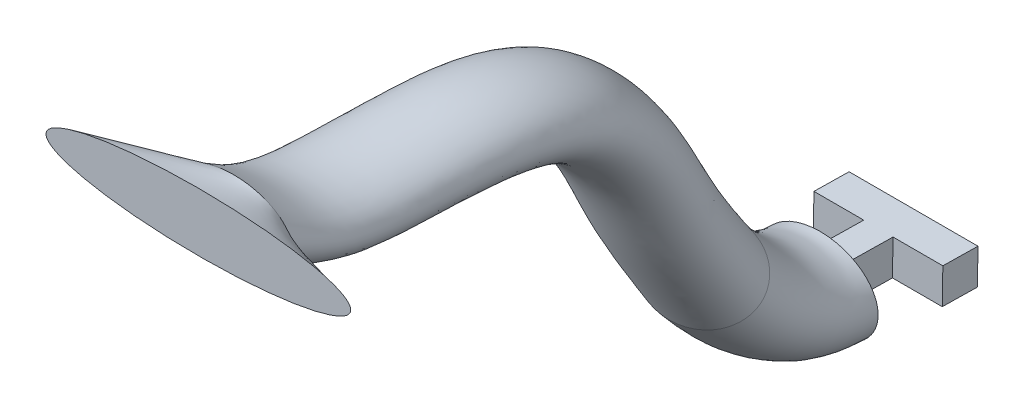
ISO-10303-21;
HEADER;
FILE_DESCRIPTION(('STEP AP214'),'2;1');
FILE_NAME('part.step','',(''),(''),'','','');
FILE_SCHEMA(('AUTOMOTIVE_DESIGN { 1 0 10303 214 1 1 1 1 }'));
ENDSEC;
DATA;
#1=APPLICATION_CONTEXT('core data for automotive mechanical design processes');
#2=APPLICATION_PROTOCOL_DEFINITION('international standard','automotive_design',2000,#1);
#3=PRODUCT_CONTEXT('',#1,'mechanical');
#4=PRODUCT('Part','Part','',(#3));
#5=PRODUCT_RELATED_PRODUCT_CATEGORY('part','',(#4));
#6=PRODUCT_DEFINITION_FORMATION('','',#4);
#7=PRODUCT_DEFINITION_CONTEXT('part definition',#1,'design');
#8=PRODUCT_DEFINITION('design','',#6,#7);
#9=PRODUCT_DEFINITION_SHAPE('','',#8);
#10=(LENGTH_UNIT() NAMED_UNIT(*) SI_UNIT(.MILLI.,.METRE.));
#11=(NAMED_UNIT(*) PLANE_ANGLE_UNIT() SI_UNIT($,.RADIAN.));
#12=(NAMED_UNIT(*) SI_UNIT($,.STERADIAN.) SOLID_ANGLE_UNIT());
#13=UNCERTAINTY_MEASURE_WITH_UNIT(LENGTH_MEASURE(1.E-05),#10,'distance_accuracy_value','');
#14=(GEOMETRIC_REPRESENTATION_CONTEXT(3) GLOBAL_UNCERTAINTY_ASSIGNED_CONTEXT((#13)) GLOBAL_UNIT_ASSIGNED_CONTEXT((#10,
#11,#12)) REPRESENTATION_CONTEXT('',''));
#15=CARTESIAN_POINT('',(0.,0.,0.));
#16=DIRECTION('',(0.,0.,1.));
#17=DIRECTION('',(1.,0.,0.));
#18=AXIS2_PLACEMENT_3D('',#15,#16,#17);
#19=CARTESIAN_POINT('',(1.25,-28.5002006384358,-55.0245456775714));
#20=DIRECTION('',(-1.,0.,0.));
#21=DIRECTION('',(0.,-1.,0.));
#22=AXIS2_PLACEMENT_3D('',#19,#20,#21);
#23=PLANE('',#22);
#24=DIRECTION('',(0.,-0.999857410804947,0.0168866236538769));
#25=VECTOR('',#24,1.);
#26=CARTESIAN_POINT('',(1.25,-28.4157675201664,-50.0252586235467));
#27=LINE('',#26,#25);
#28=CARTESIAN_POINT('',(1.25,-28.4157675201664,-50.0252586235467));
#29=VERTEX_POINT('',#28);
#30=CARTESIAN_POINT('',(1.24999999999999,-31.4153397525812,-49.974598752585));
#31=VERTEX_POINT('',#30);
#32=EDGE_CURVE('E113',#29,#31,#27,.T.);
#33=ORIENTED_EDGE('',*,*,#32,.T.);
#34=DIRECTION('',(0.,0.0168866236538767,0.999857410804947));
#35=VECTOR('',#34,1.);
#36=CARTESIAN_POINT('',(1.24999999999999,-31.4997728708506,-54.9738858066098));
#37=LINE('',#36,#35);
#38=CARTESIAN_POINT('',(1.25,-31.4997728708506,-54.9738858066098));
#39=VERTEX_POINT('',#38);
#40=EDGE_CURVE('E13',#39,#31,#37,.T.);
#41=ORIENTED_EDGE('',*,*,#40,.F.);
#42=DIRECTION('',(0.,-0.999857410804947,0.0168866236538769));
#43=VECTOR('',#42,1.);
#44=CARTESIAN_POINT('',(1.25,-28.5002006384358,-55.0245456775714));
#45=LINE('',#44,#43);
#46=CARTESIAN_POINT('',(1.25,-28.5002006384358,-55.0245456775714));
#47=VERTEX_POINT('',#46);
#48=EDGE_CURVE('E114',#47,#39,#45,.T.);
#49=ORIENTED_EDGE('',*,*,#48,.F.);
#50=DIRECTION('',(0.,0.0168866236538767,0.999857410804947));
#51=VECTOR('',#50,1.);
#52=CARTESIAN_POINT('',(1.25,-28.5002006384358,-55.0245456775714));
#53=LINE('',#52,#51);
#54=EDGE_CURVE('E101',#47,#29,#53,.T.);
#55=ORIENTED_EDGE('',*,*,#54,.T.);
#56=EDGE_LOOP('',(#33,#41,#49,#55));
#57=FACE_BOUND('',#56,.T.);
#58=ADVANCED_FACE('F55',(#57),#23,.F.);
#59=CARTESIAN_POINT('',(1.24999999999999,-31.4997728708506,-54.9738858066098));
#60=DIRECTION('',(0.,0.999857410804947,-0.0168866236538767));
#61=DIRECTION('',(0.,0.0168866236538767,0.999857410804947));
#62=AXIS2_PLACEMENT_3D('',#59,#60,#61);
#63=PLANE('',#62);
#64=DIRECTION('',(-1.,0.,0.));
#65=VECTOR('',#64,1.);
#66=CARTESIAN_POINT('',(1.24999999999999,-31.4153397525812,-49.974598752585));
#67=LINE('',#66,#65);
#68=CARTESIAN_POINT('',(-1.25000000000001,-31.4153397525812,-49.974598752585));
#69=VERTEX_POINT('',#68);
#70=EDGE_CURVE('E108',#31,#69,#67,.T.);
#71=ORIENTED_EDGE('',*,*,#70,.T.);
#72=DIRECTION('',(0.,0.0168866236538767,0.999857410804947));
#73=VECTOR('',#72,1.);
#74=CARTESIAN_POINT('',(-1.25000000000001,-31.4997728708506,-54.9738858066098));
#75=LINE('',#74,#73);
#76=CARTESIAN_POINT('',(-1.25000000000001,-31.4997728708506,-54.9738858066098));
#77=VERTEX_POINT('',#76);
#78=EDGE_CURVE('E64',#77,#69,#75,.T.);
#79=ORIENTED_EDGE('',*,*,#78,.F.);
#80=DIRECTION('',(-1.,0.,0.));
#81=VECTOR('',#80,1.);
#82=CARTESIAN_POINT('',(5.50000000000001,-31.4997728708506,-54.9738858066098));
#83=LINE('',#82,#81);
#84=CARTESIAN_POINT('',(-5.49999999999998,-31.4997728708506,-54.9738858066098));
#85=VERTEX_POINT('',#84);
#86=EDGE_CURVE('E71',#77,#85,#83,.T.);
#87=ORIENTED_EDGE('',*,*,#86,.T.);
#88=DIRECTION('',(0.,0.0168866236538769,0.999857410804947));
#89=VECTOR('',#88,1.);
#90=CARTESIAN_POINT('',(-5.49999999999998,-31.5504327418122,-57.9734580390246));
#91=LINE('',#90,#89);
#92=CARTESIAN_POINT('',(-5.49999999999998,-31.5504327418122,-57.9734580390246));
#93=VERTEX_POINT('',#92);
#94=EDGE_CURVE('E209',#93,#85,#91,.T.);
#95=ORIENTED_EDGE('',*,*,#94,.F.);
#96=DIRECTION('',(-1.,0.,0.));
#97=VECTOR('',#96,1.);
#98=CARTESIAN_POINT('',(5.50000000000001,-31.5504327418122,-57.9734580390246));
#99=LINE('',#98,#97);
#100=CARTESIAN_POINT('',(5.50000000000001,-31.5504327418122,-57.9734580390246));
#101=VERTEX_POINT('',#100);
#102=EDGE_CURVE('E181',#101,#93,#99,.T.);
#103=ORIENTED_EDGE('',*,*,#102,.F.);
#104=DIRECTION('',(0.,0.0168866236538769,0.999857410804947));
#105=VECTOR('',#104,1.);
#106=CARTESIAN_POINT('',(5.50000000000001,-31.5504327418122,-57.9734580390246));
#107=LINE('',#106,#105);
#108=CARTESIAN_POINT('',(5.50000000000001,-31.4997728708506,-54.9738858066098));
#109=VERTEX_POINT('',#108);
#110=EDGE_CURVE('E131',#101,#109,#107,.T.);
#111=ORIENTED_EDGE('',*,*,#110,.T.);
#112=EDGE_CURVE('E138',#109,#39,#83,.T.);
#113=ORIENTED_EDGE('',*,*,#112,.T.);
#114=ORIENTED_EDGE('',*,*,#40,.T.);
#115=EDGE_LOOP('',(#71,#79,#87,#95,#103,#111,#113,#114));
#116=FACE_BOUND('',#115,.T.);
#117=ADVANCED_FACE('F133',(#116),#63,.F.);
#118=CARTESIAN_POINT('',(-1.25,-28.5002006384358,-55.0245456775714));
#119=DIRECTION('',(-1.,0.,0.));
#120=DIRECTION('',(0.,-1.,0.));
#121=AXIS2_PLACEMENT_3D('',#118,#119,#120);
#122=PLANE('',#121);
#123=DIRECTION('',(0.,-0.999857410804947,0.0168866236538769));
#124=VECTOR('',#123,1.);
#125=CARTESIAN_POINT('',(-1.25,-28.4157675201664,-50.0252586235467));
#126=LINE('',#125,#124);
#127=CARTESIAN_POINT('',(-1.25,-28.4157675201664,-50.0252586235467));
#128=VERTEX_POINT('',#127);
#129=EDGE_CURVE('E104',#128,#69,#126,.T.);
#130=ORIENTED_EDGE('',*,*,#129,.F.);
#131=DIRECTION('',(0.,0.0168866236538767,0.999857410804947));
#132=VECTOR('',#131,1.);
#133=CARTESIAN_POINT('',(-1.25,-28.5002006384358,-55.0245456775714));
#134=LINE('',#133,#132);
#135=CARTESIAN_POINT('',(-1.25000000000001,-28.5002006384358,-55.0245456775714));
#136=VERTEX_POINT('',#135);
#137=EDGE_CURVE('E89',#136,#128,#134,.T.);
#138=ORIENTED_EDGE('',*,*,#137,.F.);
#139=DIRECTION('',(0.,-0.999857410804947,0.0168866236538769));
#140=VECTOR('',#139,1.);
#141=CARTESIAN_POINT('',(-1.25,-28.5002006384358,-55.0245456775714));
#142=LINE('',#141,#140);
#143=EDGE_CURVE('E117',#136,#77,#142,.T.);
#144=ORIENTED_EDGE('',*,*,#143,.T.);
#145=ORIENTED_EDGE('',*,*,#78,.T.);
#146=EDGE_LOOP('',(#130,#138,#144,#145));
#147=FACE_BOUND('',#146,.T.);
#148=ADVANCED_FACE('F105',(#147),#122,.T.);
#149=CARTESIAN_POINT('',(1.25,-28.5002006384358,-55.0245456775714));
#150=DIRECTION('',(0.,0.999857410804947,-0.0168866236538767));
#151=DIRECTION('',(0.,0.0168866236538767,0.999857410804947));
#152=AXIS2_PLACEMENT_3D('',#149,#150,#151);
#153=PLANE('',#152);
#154=DIRECTION('',(-1.,0.,0.));
#155=VECTOR('',#154,1.);
#156=CARTESIAN_POINT('',(1.25,-28.4157675201664,-50.0252586235467));
#157=LINE('',#156,#155);
#158=EDGE_CURVE('E94',#29,#128,#157,.T.);
#159=ORIENTED_EDGE('',*,*,#158,.F.);
#160=ORIENTED_EDGE('',*,*,#54,.F.);
#161=DIRECTION('',(-1.,0.,0.));
#162=VECTOR('',#161,1.);
#163=CARTESIAN_POINT('',(5.50000000000001,-28.5002006384358,-55.0245456775714));
#164=LINE('',#163,#162);
#165=CARTESIAN_POINT('',(5.50000000000001,-28.5002006384358,-55.0245456775714));
#166=VERTEX_POINT('',#165);
#167=EDGE_CURVE('E150',#166,#47,#164,.T.);
#168=ORIENTED_EDGE('',*,*,#167,.F.);
#169=DIRECTION('',(0.,0.0168866236538769,0.999857410804947));
#170=VECTOR('',#169,1.);
#171=CARTESIAN_POINT('',(5.50000000000001,-28.5508605093974,-58.0241179099862));
#172=LINE('',#171,#170);
#173=CARTESIAN_POINT('',(5.50000000000001,-28.5508605093974,-58.0241179099862));
#174=VERTEX_POINT('',#173);
#175=EDGE_CURVE('E174',#174,#166,#172,.T.);
#176=ORIENTED_EDGE('',*,*,#175,.F.);
#177=DIRECTION('',(-1.,0.,0.));
#178=VECTOR('',#177,1.);
#179=CARTESIAN_POINT('',(5.50000000000001,-28.5508605093974,-58.0241179099862));
#180=LINE('',#179,#178);
#181=CARTESIAN_POINT('',(-5.49999999999998,-28.5508605093974,-58.0241179099862));
#182=VERTEX_POINT('',#181);
#183=EDGE_CURVE('E176',#174,#182,#180,.T.);
#184=ORIENTED_EDGE('',*,*,#183,.T.);
#185=DIRECTION('',(0.,0.0168866236538769,0.999857410804947));
#186=VECTOR('',#185,1.);
#187=CARTESIAN_POINT('',(-5.49999999999998,-28.5508605093974,-58.0241179099862));
#188=LINE('',#187,#186);
#189=CARTESIAN_POINT('',(-5.49999999999998,-28.5002006384358,-55.0245456775714));
#190=VERTEX_POINT('',#189);
#191=EDGE_CURVE('E180',#182,#190,#188,.T.);
#192=ORIENTED_EDGE('',*,*,#191,.T.);
#193=EDGE_CURVE('E98',#136,#190,#164,.T.);
#194=ORIENTED_EDGE('',*,*,#193,.F.);
#195=ORIENTED_EDGE('',*,*,#137,.T.);
#196=EDGE_LOOP('',(#159,#160,#168,#176,#184,#192,#194,#195));
#197=FACE_BOUND('',#196,.T.);
#198=ADVANCED_FACE('F91',(#197),#153,.T.);
#199=CARTESIAN_POINT('',(0.,-0.852740247335799,-50.4907714689664));
#200=DIRECTION('',(0.,-0.0168866236538769,-0.999857410804947));
#201=DIRECTION('',(0.,0.999857410804947,-0.0168866236538769));
#202=AXIS2_PLACEMENT_3D('',#199,#200,#201);
#203=PLANE('',#202);
#204=ORIENTED_EDGE('',*,*,#32,.F.);
#205=ORIENTED_EDGE('',*,*,#158,.T.);
#206=ORIENTED_EDGE('',*,*,#129,.T.);
#207=ORIENTED_EDGE('',*,*,#70,.F.);
#208=EDGE_LOOP('',(#204,#205,#206,#207));
#209=FACE_BOUND('',#208,.T.);
#210=ADVANCED_FACE('F111',(#209),#203,.F.);
#211=CARTESIAN_POINT('',(0.,-0.937173365605184,-55.4900585229912));
#212=DIRECTION('',(0.,0.0168866236538769,0.999857410804947));
#213=DIRECTION('',(0.,-0.999857410804947,0.0168866236538769));
#214=AXIS2_PLACEMENT_3D('',#211,#212,#213);
#215=PLANE('',#214);
#216=ORIENTED_EDGE('',*,*,#143,.F.);
#217=ORIENTED_EDGE('',*,*,#193,.T.);
#218=DIRECTION('',(0.,0.999857410804947,-0.0168866236538769));
#219=VECTOR('',#218,1.);
#220=CARTESIAN_POINT('',(-5.49999999999998,-31.4997728708506,-54.9738858066098));
#221=LINE('',#220,#219);
#222=EDGE_CURVE('E202',#85,#190,#221,.T.);
#223=ORIENTED_EDGE('',*,*,#222,.F.);
#224=ORIENTED_EDGE('',*,*,#86,.F.);
#225=EDGE_LOOP('',(#216,#217,#223,#224));
#226=FACE_BOUND('',#225,.T.);
#227=ADVANCED_FACE('F218',(#226),#215,.T.);
#228=CARTESIAN_POINT('',(5.50000000000001,-31.5504327418122,-57.9734580390246));
#229=DIRECTION('',(1.,0.,0.));
#230=DIRECTION('',(0.,0.,-1.));
#231=AXIS2_PLACEMENT_3D('',#228,#229,#230);
#232=PLANE('',#231);
#233=DIRECTION('',(0.,0.999857410804947,-0.0168866236538769));
#234=VECTOR('',#233,1.);
#235=CARTESIAN_POINT('',(5.50000000000001,-31.4997728708506,-54.9738858066098));
#236=LINE('',#235,#234);
#237=EDGE_CURVE('E198',#109,#166,#236,.T.);
#238=ORIENTED_EDGE('',*,*,#237,.F.);
#239=ORIENTED_EDGE('',*,*,#110,.F.);
#240=DIRECTION('',(0.,0.999857410804947,-0.0168866236538769));
#241=VECTOR('',#240,1.);
#242=CARTESIAN_POINT('',(5.50000000000001,-31.5504327418122,-57.9734580390246));
#243=LINE('',#242,#241);
#244=EDGE_CURVE('E186',#101,#174,#243,.T.);
#245=ORIENTED_EDGE('',*,*,#244,.T.);
#246=ORIENTED_EDGE('',*,*,#175,.T.);
#247=EDGE_LOOP('',(#238,#239,#245,#246));
#248=FACE_BOUND('',#247,.T.);
#249=ADVANCED_FACE('F191',(#248),#232,.T.);
#250=CARTESIAN_POINT('',(-5.49999999999998,-31.5504327418122,-57.9734580390246));
#251=DIRECTION('',(1.,0.,0.));
#252=DIRECTION('',(0.,0.,-1.));
#253=AXIS2_PLACEMENT_3D('',#250,#251,#252);
#254=PLANE('',#253);
#255=ORIENTED_EDGE('',*,*,#222,.T.);
#256=ORIENTED_EDGE('',*,*,#191,.F.);
#257=DIRECTION('',(0.,0.999857410804947,-0.0168866236538769));
#258=VECTOR('',#257,1.);
#259=CARTESIAN_POINT('',(-5.49999999999998,-31.5504327418122,-57.9734580390246));
#260=LINE('',#259,#258);
#261=EDGE_CURVE('E188',#93,#182,#260,.T.);
#262=ORIENTED_EDGE('',*,*,#261,.F.);
#263=ORIENTED_EDGE('',*,*,#94,.T.);
#264=EDGE_LOOP('',(#255,#256,#262,#263));
#265=FACE_BOUND('',#264,.T.);
#266=ADVANCED_FACE('F217',(#265),#254,.F.);
#267=CARTESIAN_POINT('',(0.,-0.987833236566815,-58.489630755406));
#268=DIRECTION('',(0.,0.0168866236538769,0.999857410804947));
#269=DIRECTION('',(0.,-0.999857410804947,0.0168866236538769));
#270=AXIS2_PLACEMENT_3D('',#267,#268,#269);
#271=PLANE('',#270);
#272=ORIENTED_EDGE('',*,*,#244,.F.);
#273=ORIENTED_EDGE('',*,*,#102,.T.);
#274=ORIENTED_EDGE('',*,*,#261,.T.);
#275=ORIENTED_EDGE('',*,*,#183,.F.);
#276=EDGE_LOOP('',(#272,#273,#274,#275));
#277=FACE_BOUND('',#276,.T.);
#278=ADVANCED_FACE('F185',(#277),#271,.F.);
#279=ORIENTED_EDGE('',*,*,#167,.T.);
#280=ORIENTED_EDGE('',*,*,#48,.T.);
#281=ORIENTED_EDGE('',*,*,#112,.F.);
#282=ORIENTED_EDGE('',*,*,#237,.T.);
#283=EDGE_LOOP('',(#279,#280,#281,#282));
#284=FACE_BOUND('',#283,.T.);
#285=ADVANCED_FACE('F221',(#284),#215,.T.);
#286=CLOSED_SHELL('',(#58,#117,#148,#198,#210,#227,#249,#266,#278,#285));
#287=MANIFOLD_SOLID_BREP('B2',#286);
#288=CARTESIAN_POINT('',(-5.,0.,0.));
#289=CARTESIAN_POINT('',(-5.,-0.853881450719064,-1.75205988960103));
#290=CARTESIAN_POINT('',(-5.,-2.57155411642172,-5.27651328826358));
#291=CARTESIAN_POINT('',(-5.,-2.88270973912958,-11.2239530258684));
#292=CARTESIAN_POINT('',(-5.,-3.01079803413071,-16.4846982848515));
#293=CARTESIAN_POINT('',(-5.,-3.37813638586674,-21.0440263464884));
#294=CARTESIAN_POINT('',(-5.,-4.25009553557255,-24.7776377723047));
#295=CARTESIAN_POINT('',(-5.,-6.28883352384999,-28.8717387039558));
#296=CARTESIAN_POINT('',(-5.,-10.7793378739405,-32.7833273288068));
#297=CARTESIAN_POINT('',(-5.,-17.4395879114166,-35.7253039664786));
#298=CARTESIAN_POINT('',(-5.,-21.7394320086001,-38.5426413388619));
#299=CARTESIAN_POINT('',(-5.,-23.9729515029093,-40.0060846175115));
#300=CARTESIAN_POINT('',(-5.,-6.,0.));
#301=CARTESIAN_POINT('',(-5.,-6.74510752468008,-2.51089442414352));
#302=CARTESIAN_POINT('',(-5.,-8.24396995701722,-7.56182358437366));
#303=CARTESIAN_POINT('',(-5.,-8.32914554490508,-13.7976153515125));
#304=CARTESIAN_POINT('',(-5.,-8.68649045792541,-18.8056395754351));
#305=CARTESIAN_POINT('',(-5.,-9.51751271745117,-22.2908376495362));
#306=CARTESIAN_POINT('',(-4.99999999999999,-10.7073757400259,-24.4233851410402));
#307=CARTESIAN_POINT('',(-5.,-12.3199455425964,-25.5670665363477));
#308=CARTESIAN_POINT('',(-5.,-14.8588126708258,-27.2288486109863));
#309=CARTESIAN_POINT('',(-5.,-20.557216248969,-29.3999180690181));
#310=CARTESIAN_POINT('',(-5.,-25.8929775961605,-32.6467694813133));
#311=CARTESIAN_POINT('',(-5.,-28.6645959889624,-34.3333203795742));
#312=CARTESIAN_POINT('',(5.,-6.,0.));
#313=CARTESIAN_POINT('',(5.,-6.74510752468008,-2.51089442414352));
#314=CARTESIAN_POINT('',(5.,-8.24396995701722,-7.56182358437366));
#315=CARTESIAN_POINT('',(5.,-8.32914554490508,-13.7976153515125));
#316=CARTESIAN_POINT('',(5.,-8.68649045792541,-18.8056395754351));
#317=CARTESIAN_POINT('',(5.,-9.51751271745117,-22.2908376495362));
#318=CARTESIAN_POINT('',(5.,-10.7073757400259,-24.4233851410402));
#319=CARTESIAN_POINT('',(5.,-12.3199455425964,-25.5670665363477));
#320=CARTESIAN_POINT('',(5.,-14.8588126708258,-27.2288486109863));
#321=CARTESIAN_POINT('',(5.,-20.557216248969,-29.3999180690181));
#322=CARTESIAN_POINT('',(5.,-25.8929775961605,-32.6467694813133));
#323=CARTESIAN_POINT('',(5.,-28.6645959889624,-34.3333203795742));
#324=CARTESIAN_POINT('',(5.,0.,0.));
#325=CARTESIAN_POINT('',(5.,-0.853881450719064,-1.75205988960103));
#326=CARTESIAN_POINT('',(5.,-2.57155411642172,-5.27651328826358));
#327=CARTESIAN_POINT('',(5.,-2.88270973912958,-11.2239530258684));
#328=CARTESIAN_POINT('',(5.,-3.01079803413071,-16.4846982848515));
#329=CARTESIAN_POINT('',(5.,-3.37813638586674,-21.0440263464884));
#330=CARTESIAN_POINT('',(5.,-4.25009553557255,-24.7776377723047));
#331=CARTESIAN_POINT('',(5.,-6.28883352384999,-28.8717387039558));
#332=CARTESIAN_POINT('',(5.,-10.7793378739405,-32.7833273288068));
#333=CARTESIAN_POINT('',(5.,-17.4395879114166,-35.7253039664786));
#334=CARTESIAN_POINT('',(5.,-21.7394320086001,-38.5426413388619));
#335=CARTESIAN_POINT('',(5.,-23.9729515029093,-40.0060846175115));
#336=CARTESIAN_POINT('',(5.,6.,0.));
#337=CARTESIAN_POINT('',(5.,5.03734462324195,-0.993225355058546));
#338=CARTESIAN_POINT('',(5.,3.10086172417378,-2.99120299215349));
#339=CARTESIAN_POINT('',(5.,2.56372606664591,-8.6502907002242));
#340=CARTESIAN_POINT('',(5.,2.66489438966399,-14.1637569942678));
#341=CARTESIAN_POINT('',(5.,2.76123994571768,-19.7972150434406));
#342=CARTESIAN_POINT('',(4.99999999999999,2.20718466888083,-25.1318904035692));
#343=CARTESIAN_POINT('',(5.,-0.257721505103621,-32.176410871564));
#344=CARTESIAN_POINT('',(5.,-6.69986307705511,-38.3378060466272));
#345=CARTESIAN_POINT('',(5.,-14.3219595738643,-42.050689863939));
#346=CARTESIAN_POINT('',(5.,-17.5858864210396,-44.4385131964106));
#347=CARTESIAN_POINT('',(5.,-19.2813070168563,-45.6788488554488));
#348=CARTESIAN_POINT('',(-5.,6.,0.));
#349=CARTESIAN_POINT('',(-5.,5.03734462324195,-0.993225355058546));
#350=CARTESIAN_POINT('',(-5.,3.10086172417378,-2.99120299215349));
#351=CARTESIAN_POINT('',(-5.,2.56372606664591,-8.6502907002242));
#352=CARTESIAN_POINT('',(-5.,2.66489438966399,-14.1637569942678));
#353=CARTESIAN_POINT('',(-5.,2.76123994571768,-19.7972150434406));
#354=CARTESIAN_POINT('',(-5.,2.20718466888083,-25.1318904035692));
#355=CARTESIAN_POINT('',(-5.,-0.257721505103621,-32.176410871564));
#356=CARTESIAN_POINT('',(-5.,-6.69986307705511,-38.3378060466272));
#357=CARTESIAN_POINT('',(-5.,-14.3219595738643,-42.050689863939));
#358=CARTESIAN_POINT('',(-5.,-17.5858864210396,-44.4385131964106));
#359=CARTESIAN_POINT('',(-5.,-19.2813070168563,-45.6788488554488));
#360=CARTESIAN_POINT('',(-5.,0.,0.));
#361=CARTESIAN_POINT('',(-5.,-0.853881450719064,-1.75205988960103));
#362=CARTESIAN_POINT('',(-5.,-2.57155411642172,-5.27651328826358));
#363=CARTESIAN_POINT('',(-5.,-2.88270973912958,-11.2239530258684));
#364=CARTESIAN_POINT('',(-5.,-3.01079803413071,-16.4846982848515));
#365=CARTESIAN_POINT('',(-5.,-3.37813638586674,-21.0440263464884));
#366=CARTESIAN_POINT('',(-5.,-4.25009553557255,-24.7776377723047));
#367=CARTESIAN_POINT('',(-5.,-6.28883352384999,-28.8717387039558));
#368=CARTESIAN_POINT('',(-5.,-10.7793378739405,-32.7833273288068));
#369=CARTESIAN_POINT('',(-5.,-17.4395879114166,-35.7253039664786));
#370=CARTESIAN_POINT('',(-5.,-21.7394320086001,-38.5426413388619));
#371=CARTESIAN_POINT('',(-5.,-23.9729515029093,-40.0060846175115));
#372=(BOUNDED_SURFACE() B_SPLINE_SURFACE(3,3,((#288,#289,#290,#291,#292,#293,#294,#295,#296,
#297,#298,#299),(#300,#301,#302,#303,#304,#305,#306,#307,#308,#309,#310,#311),(#312,#313,#314,
#315,#316,#317,#318,#319,#320,#321,#322,#323),(#324,#325,#326,#327,#328,#329,#330,#331,#332,
#333,#334,#335),(#336,#337,#338,#339,#340,#341,#342,#343,#344,#345,#346,#347),(#348,#349,#350,
#351,#352,#353,#354,#355,#356,#357,#358,#359),(#360,#361,#362,#363,#364,#365,#366,#367,#368,
#369,#370,#371)),.UNSPECIFIED.,.T.,.F.,.F.) B_SPLINE_SURFACE_WITH_KNOTS((4,3,4),(4,1,1,1,1,1,1,
1,1,4),(0.,0.5,1.),(0.,0.115089111175291,0.231513894837905,0.344783295272171,0.42682553091255,
0.501516670505765,0.571283271466905,0.697446018738273,0.842840763535686,1.),
.UNSPECIFIED.) GEOMETRIC_REPRESENTATION_ITEM() RATIONAL_B_SPLINE_SURFACE(((1.,1.,1.,1.,1.,1.,1.,
1.,1.,1.,1.,1.),(0.333333333333333,0.333333333333333,0.333333333333333,0.333333333333334,
0.333333333333333,0.333333333333333,0.333333333333333,0.333333333333333,0.333333333333333,
0.333333333333333,0.333333333333333,0.333333333333333),(0.333333333333333,0.333333333333333,
0.333333333333333,0.333333333333334,0.333333333333333,0.333333333333333,0.333333333333333,
0.333333333333333,0.333333333333333,0.333333333333333,0.333333333333333,0.333333333333333),(1.,
1.,1.,1.,1.,1.,1.,1.,1.,1.,1.,1.),(0.333333333333333,0.333333333333333,0.333333333333333,
0.333333333333334,0.333333333333333,0.333333333333333,0.333333333333333,0.333333333333333,
0.333333333333333,0.333333333333333,0.333333333333333,0.333333333333333),(0.333333333333333,
0.333333333333333,0.333333333333333,0.333333333333334,0.333333333333333,0.333333333333333,
0.333333333333333,0.333333333333333,0.333333333333333,0.333333333333333,0.333333333333333,
0.333333333333333),(1.,1.,1.,1.,1.,1.,1.,1.,1.,1.,1.,1.))) REPRESENTATION_ITEM('') SURFACE());
#373=CARTESIAN_POINT('',(4.8040893261107,0.831541501567865,0.));
#374=CARTESIAN_POINT('',(2.03228432088449,6.59644869290071,0.));
#375=CARTESIAN_POINT('',(-7.57589433133692,4.93336568976498,0.));
#376=CARTESIAN_POINT('',(-4.8040893261107,-0.831541501567865,0.));
#377=CARTESIAN_POINT('',(-2.03228432088448,-6.5964486929007,0.));
#378=CARTESIAN_POINT('',(7.57589433133691,-4.93336568976497,0.));
#379=CARTESIAN_POINT('',(4.8040893261107,0.831541501567865,0.));
#380=(BOUNDED_CURVE() B_SPLINE_CURVE(3,(#373,#374,#375,#376,#377,#378,#379),.UNSPECIFIED.,.T.,
.F.) B_SPLINE_CURVE_WITH_KNOTS((4,3,4),(0.,0.5,1.),
.UNSPECIFIED.) CURVE() GEOMETRIC_REPRESENTATION_ITEM() RATIONAL_B_SPLINE_CURVE((1.,
0.333333333333333,0.333333333333333,1.,0.333333333333333,0.333333333333333,1.)) REPRESENTATION_ITEM(''));
#381=CARTESIAN_POINT('',(4.8040893261107,0.831541501567865,0.));
#382=VERTEX_POINT('',#381);
#383=EDGE_CURVE('E54',#382,#382,#380,.T.);
#384=CARTESIAN_POINT('',(-5.,-23.9729515029093,-40.0060846175115));
#385=CARTESIAN_POINT('',(-5.,-28.6645959889624,-34.3333203795742));
#386=CARTESIAN_POINT('',(5.,-28.6645959889624,-34.3333203795742));
#387=CARTESIAN_POINT('',(5.,-23.9729515029093,-40.0060846175115));
#388=CARTESIAN_POINT('',(5.,-19.2813070168563,-45.6788488554488));
#389=CARTESIAN_POINT('',(-5.,-19.2813070168563,-45.6788488554488));
#390=CARTESIAN_POINT('',(-5.,-23.9729515029093,-40.0060846175115));
#391=(BOUNDED_CURVE() B_SPLINE_CURVE(3,(#384,#385,#386,#387,#388,#389,#390),.UNSPECIFIED.,.T.,
.F.) B_SPLINE_CURVE_WITH_KNOTS((4,3,4),(0.,0.5,1.),
.UNSPECIFIED.) CURVE() GEOMETRIC_REPRESENTATION_ITEM() RATIONAL_B_SPLINE_CURVE((1.,
0.333333333333333,0.333333333333333,1.,0.333333333333333,0.333333333333333,1.)) REPRESENTATION_ITEM(''));
#392=CARTESIAN_POINT('',(-5.,-23.9729515029093,-40.0060846175115));
#393=VERTEX_POINT('',#392);
#394=EDGE_CURVE('E317',#393,#393,#391,.F.);
#395=ORIENTED_EDGE('',*,*,#383,.F.);
#396=EDGE_LOOP('',(#395));
#397=FACE_BOUND('',#396,.T.);
#398=ORIENTED_EDGE('',*,*,#394,.F.);
#399=EDGE_LOOP('',(#398));
#400=FACE_BOUND('',#399,.T.);
#401=ADVANCED_FACE('F306',(#397,#400),#372,.F.);
#402=CARTESIAN_POINT('',(5.,-29.9155536363738,-49.9999286880659));
#403=DIRECTION('',(0.,0.0168866236538767,0.999857410804947));
#404=DIRECTION('',(0.,-0.999857410804947,0.0168866236538767));
#405=AXIS2_PLACEMENT_3D('',#402,#403,#404);
#406=PLANE('',#405);
#407=CARTESIAN_POINT('',(-5.,-29.9155536363738,-49.9999286880659));
#408=CARTESIAN_POINT('',(-5.,-22.5554480096534,-50.1242337463953));
#409=CARTESIAN_POINT('',(5.,-22.5554480096534,-50.1242337463953));
#410=CARTESIAN_POINT('',(5.,-29.9155536363738,-49.9999286880659));
#411=CARTESIAN_POINT('',(5.,-37.2756592630942,-49.8756236297364));
#412=CARTESIAN_POINT('',(-5.,-37.2756592630942,-49.8756236297364));
#413=CARTESIAN_POINT('',(-5.,-29.9155536363738,-49.9999286880659));
#414=(BOUNDED_CURVE() B_SPLINE_CURVE(3,(#407,#408,#409,#410,#411,#412,#413),.UNSPECIFIED.,.T.,
.F.) B_SPLINE_CURVE_WITH_KNOTS((4,3,4),(0.,0.5,1.),
.UNSPECIFIED.) CURVE() GEOMETRIC_REPRESENTATION_ITEM() RATIONAL_B_SPLINE_CURVE((1.,
0.333333333333333,0.333333333333333,1.,0.333333333333333,0.333333333333333,1.)) REPRESENTATION_ITEM(''));
#415=CARTESIAN_POINT('',(-5.,-29.9155536363738,-49.9999286880659));
#416=VERTEX_POINT('',#415);
#417=EDGE_CURVE('E322',#416,#416,#414,.F.);
#418=ORIENTED_EDGE('',*,*,#417,.F.);
#419=EDGE_LOOP('',(#418));
#420=FACE_BOUND('',#419,.T.);
#421=ADVANCED_FACE('F340',(#420),#406,.F.);
#422=CARTESIAN_POINT('',(-5.,-23.9729515029093,-40.0060846175115));
#423=CARTESIAN_POINT('',(-5.,-24.6648434611239,-40.5670162316809));
#424=CARTESIAN_POINT('',(-5.,-25.9336763692153,-41.6979211618122));
#425=CARTESIAN_POINT('',(-5.,-27.5430589166105,-43.5281379114855));
#426=CARTESIAN_POINT('',(-5.,-28.8169565936852,-45.5026279151554));
#427=CARTESIAN_POINT('',(-5.,-29.681274731356,-47.6585450877804));
#428=CARTESIAN_POINT('',(-5.,-29.902568878419,-49.2311008433324));
#429=CARTESIAN_POINT('',(-5.,-29.9155536363738,-49.9999286880659));
#430=CARTESIAN_POINT('',(-5.,-19.2813070168563,-45.6788488554488));
#431=CARTESIAN_POINT('',(-5.,-19.9731989750708,-46.2397804696182));
#432=CARTESIAN_POINT('',(-5.,-20.6217050361705,-46.8269175415092));
#433=CARTESIAN_POINT('',(-5.,-21.6764943856806,-48.028756861146));
#434=CARTESIAN_POINT('',(-5.,-22.2430292664344,-48.8484326846439));
#435=CARTESIAN_POINT('',(-5.,-22.5134436213564,-49.890939953397));
#436=CARTESIAN_POINT('',(-5.,-22.5424632516986,-49.3554059016618));
#437=CARTESIAN_POINT('',(-5.,-22.5554480096534,-50.1242337463953));
#438=CARTESIAN_POINT('',(5.,-19.2813070168563,-45.6788488554488));
#439=CARTESIAN_POINT('',(5.,-19.9731989750708,-46.2397804696182));
#440=CARTESIAN_POINT('',(5.,-20.6217050361705,-46.8269175415092));
#441=CARTESIAN_POINT('',(5.,-21.6764943856806,-48.028756861146));
#442=CARTESIAN_POINT('',(5.,-22.2430292664344,-48.8484326846439));
#443=CARTESIAN_POINT('',(5.,-22.5134436213564,-49.890939953397));
#444=CARTESIAN_POINT('',(5.,-22.5424632516986,-49.3554059016618));
#445=CARTESIAN_POINT('',(5.,-22.5554480096534,-50.1242337463953));
#446=CARTESIAN_POINT('',(5.,-23.9729515029093,-40.0060846175115));
#447=CARTESIAN_POINT('',(5.,-24.6648434611239,-40.5670162316809));
#448=CARTESIAN_POINT('',(5.,-25.9336763692153,-41.6979211618122));
#449=CARTESIAN_POINT('',(5.,-27.5430589166105,-43.5281379114855));
#450=CARTESIAN_POINT('',(5.,-28.8169565936852,-45.5026279151554));
#451=CARTESIAN_POINT('',(5.,-29.681274731356,-47.6585450877804));
#452=CARTESIAN_POINT('',(5.,-29.902568878419,-49.2311008433324));
#453=CARTESIAN_POINT('',(5.,-29.9155536363738,-49.9999286880659));
#454=CARTESIAN_POINT('',(5.,-28.6645959889624,-34.3333203795742));
#455=CARTESIAN_POINT('',(5.,-29.3564879471769,-34.8942519937436));
#456=CARTESIAN_POINT('',(5.,-31.2456477022602,-36.5689247821153));
#457=CARTESIAN_POINT('',(5.,-33.4096234475405,-39.027518961825));
#458=CARTESIAN_POINT('',(5.,-35.3908839209359,-42.1568231456669));
#459=CARTESIAN_POINT('',(5.,-36.8491058413557,-45.4261502221637));
#460=CARTESIAN_POINT('',(5.,-37.2626745051394,-49.106795785003));
#461=CARTESIAN_POINT('',(5.,-37.2756592630942,-49.8756236297364));
#462=CARTESIAN_POINT('',(-5.,-28.6645959889624,-34.3333203795742));
#463=CARTESIAN_POINT('',(-5.,-29.3564879471769,-34.8942519937436));
#464=CARTESIAN_POINT('',(-5.,-31.2456477022602,-36.5689247821153));
#465=CARTESIAN_POINT('',(-5.,-33.4096234475405,-39.027518961825));
#466=CARTESIAN_POINT('',(-5.,-35.3908839209359,-42.1568231456669));
#467=CARTESIAN_POINT('',(-5.,-36.8491058413557,-45.4261502221637));
#468=CARTESIAN_POINT('',(-5.,-37.2626745051394,-49.106795785003));
#469=CARTESIAN_POINT('',(-5.,-37.2756592630942,-49.8756236297364));
#470=CARTESIAN_POINT('',(-5.,-23.9729515029093,-40.0060846175115));
#471=CARTESIAN_POINT('',(-5.,-24.6648434611239,-40.5670162316809));
#472=CARTESIAN_POINT('',(-5.,-25.9336763692153,-41.6979211618122));
#473=CARTESIAN_POINT('',(-5.,-27.5430589166105,-43.5281379114855));
#474=CARTESIAN_POINT('',(-5.,-28.8169565936852,-45.5026279151554));
#475=CARTESIAN_POINT('',(-5.,-29.681274731356,-47.6585450877804));
#476=CARTESIAN_POINT('',(-5.,-29.902568878419,-49.2311008433324));
#477=CARTESIAN_POINT('',(-5.,-29.9155536363738,-49.9999286880659));
#478=(BOUNDED_SURFACE() B_SPLINE_SURFACE(3,3,((#422,#423,#424,#425,#426,#427,#428,#429),(#430,
#431,#432,#433,#434,#435,#436,#437),(#438,#439,#440,#441,#442,#443,#444,#445),(#446,#447,#448,
#449,#450,#451,#452,#453),(#454,#455,#456,#457,#458,#459,#460,#461),(#462,#463,#464,#465,#466,
#467,#468,#469),(#470,#471,#472,#473,#474,#475,#476,#477)),.UNSPECIFIED.,.T.,.F.,
.F.) B_SPLINE_SURFACE_WITH_KNOTS((4,3,4),(4,1,1,1,1,4),(0.,0.5,1.),(0.,0.222703708705272,
0.423997503892069,0.607575772847754,0.807742853024456,1.),
.UNSPECIFIED.) GEOMETRIC_REPRESENTATION_ITEM() RATIONAL_B_SPLINE_SURFACE(((1.,1.,1.,1.,1.,1.,1.,
1.),(0.333333333333333,0.333333333333333,0.333333333333333,0.333333333333333,0.333333333333333,
0.333333333333333,0.333333333333333,0.333333333333333),(0.333333333333333,0.333333333333333,
0.333333333333333,0.333333333333333,0.333333333333333,0.333333333333333,0.333333333333333,
0.333333333333333),(1.,1.,1.,1.,1.,1.,1.,1.),(0.333333333333333,0.333333333333333,
0.333333333333333,0.333333333333333,0.333333333333333,0.333333333333333,0.333333333333333,
0.333333333333333),(0.333333333333333,0.333333333333333,0.333333333333333,0.333333333333333,
0.333333333333333,0.333333333333333,0.333333333333333,0.333333333333333),(1.,1.,1.,1.,1.,1.,1.,1.))) REPRESENTATION_ITEM('') SURFACE());
#479=ORIENTED_EDGE('',*,*,#394,.T.);
#480=EDGE_LOOP('',(#479));
#481=FACE_BOUND('',#480,.T.);
#482=ORIENTED_EDGE('',*,*,#417,.T.);
#483=EDGE_LOOP('',(#482));
#484=FACE_BOUND('',#483,.T.);
#485=ADVANCED_FACE('F344',(#481,#484),#478,.T.);
#486=CARTESIAN_POINT('',(0.,1.,3.));
#487=DIRECTION('',(0.,0.,1.));
#488=DIRECTION('',(1.,0.,0.));
#489=AXIS2_PLACEMENT_3D('',#486,#487,#488);
#490=PLANE('',#489);
#491=CARTESIAN_POINT('',(0.,1.,3.));
#492=DIRECTION('',(0.,0.,1.));
#493=DIRECTION('',(-1.,0.,0.));
#494=AXIS2_PLACEMENT_3D('',#491,#492,#493);
#495=ELLIPSE('',#494,13.,2.5);
#496=CARTESIAN_POINT('',(-13.,1.,3.));
#497=VERTEX_POINT('',#496);
#498=EDGE_CURVE('E327',#497,#497,#495,.T.);
#499=ORIENTED_EDGE('',*,*,#498,.T.);
#500=EDGE_LOOP('',(#499));
#501=FACE_BOUND('',#500,.T.);
#502=ADVANCED_FACE('F349',(#501),#490,.T.);
#503=CARTESIAN_POINT('',(9.8587048987534,2.62958431325219,3.));
#504=CARTESIAN_POINT('',(4.8040893261107,0.831541501567865,0.));
#505=CARTESIAN_POINT('',(26.8063817565762,-1.16222526319142,3.));
#506=CARTESIAN_POINT('',(7.57589433133691,-4.93336568976497,0.));
#507=CARTESIAN_POINT('',(7.08897195906941,-4.42139388969581,3.));
#508=CARTESIAN_POINT('',(-2.03228432088448,-6.5964486929007,0.));
#509=CARTESIAN_POINT('',(-9.8587048987534,-0.629584313252194,3.));
#510=CARTESIAN_POINT('',(-4.8040893261107,-0.831541501567865,0.));
#511=CARTESIAN_POINT('',(-26.8063817565762,3.16222526319142,3.));
#512=CARTESIAN_POINT('',(-7.57589433133692,4.93336568976498,0.));
#513=CARTESIAN_POINT('',(-7.08897195906942,6.42139388969581,3.));
#514=CARTESIAN_POINT('',(2.03228432088449,6.59644869290071,0.));
#515=CARTESIAN_POINT('',(9.8587048987534,2.62958431325219,3.));
#516=CARTESIAN_POINT('',(4.8040893261107,0.831541501567865,0.));
#517=(BOUNDED_SURFACE() B_SPLINE_SURFACE(3,1,((#503,#504),(#505,#506),(#507,#508),(#509,#510),
(#511,#512),(#513,#514),(#515,#516)),.UNSPECIFIED.,.T.,.F.,.F.) B_SPLINE_SURFACE_WITH_KNOTS((4,
3,4),(2,2),(0.,0.5,1.),(0.,1.),
.UNSPECIFIED.) GEOMETRIC_REPRESENTATION_ITEM() RATIONAL_B_SPLINE_SURFACE(((1.,1.),
(0.333333333333333,0.333333333333333),(0.333333333333333,0.333333333333333),(1.,1.),
(0.333333333333334,0.333333333333333),(0.333333333333334,0.333333333333333),(1.,1.))) REPRESENTATION_ITEM('') SURFACE());
#518=ORIENTED_EDGE('',*,*,#498,.F.);
#519=EDGE_LOOP('',(#518));
#520=FACE_BOUND('',#519,.T.);
#521=ORIENTED_EDGE('',*,*,#383,.T.);
#522=EDGE_LOOP('',(#521));
#523=FACE_BOUND('',#522,.T.);
#524=ADVANCED_FACE('F355',(#520,#523),#517,.T.);
#525=CLOSED_SHELL('',(#401,#421,#485,#502,#524));
#526=MANIFOLD_SOLID_BREP('B7',#525);
#527=ADVANCED_BREP_SHAPE_REPRESENTATION('',(#18,#287,#526),#14);
#528=SHAPE_DEFINITION_REPRESENTATION(#9,#527);
ENDSEC;
END-ISO-10303-21;
